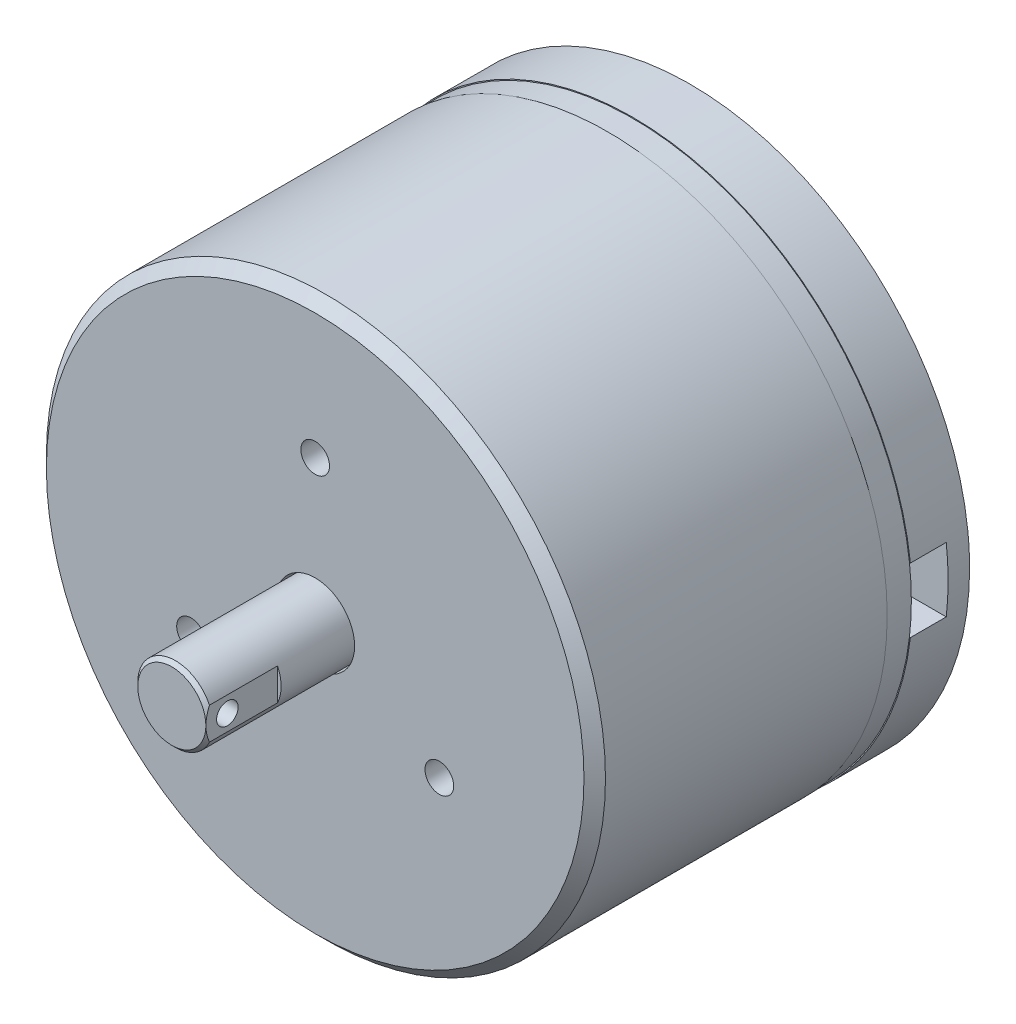
ISO-10303-21;
HEADER;
FILE_DESCRIPTION(('STEP AP214'),'2;1');
FILE_NAME('part.step','',(''),(''),'','','');
FILE_SCHEMA(('AUTOMOTIVE_DESIGN { 1 0 10303 214 1 1 1 1 }'));
ENDSEC;
DATA;
#1=APPLICATION_CONTEXT('core data for automotive mechanical design processes');
#2=APPLICATION_PROTOCOL_DEFINITION('international standard','automotive_design',2000,#1);
#3=PRODUCT_CONTEXT('',#1,'mechanical');
#4=PRODUCT('Part','Part','',(#3));
#5=PRODUCT_RELATED_PRODUCT_CATEGORY('part','',(#4));
#6=PRODUCT_DEFINITION_FORMATION('','',#4);
#7=PRODUCT_DEFINITION_CONTEXT('part definition',#1,'design');
#8=PRODUCT_DEFINITION('design','',#6,#7);
#9=PRODUCT_DEFINITION_SHAPE('','',#8);
#10=(LENGTH_UNIT() NAMED_UNIT(*) SI_UNIT(.MILLI.,.METRE.));
#11=(NAMED_UNIT(*) PLANE_ANGLE_UNIT() SI_UNIT($,.RADIAN.));
#12=(NAMED_UNIT(*) SI_UNIT($,.STERADIAN.) SOLID_ANGLE_UNIT());
#13=UNCERTAINTY_MEASURE_WITH_UNIT(LENGTH_MEASURE(1.E-05),#10,'distance_accuracy_value','');
#14=(GEOMETRIC_REPRESENTATION_CONTEXT(3) GLOBAL_UNCERTAINTY_ASSIGNED_CONTEXT((#13)) GLOBAL_UNIT_ASSIGNED_CONTEXT((#10,
#11,#12)) REPRESENTATION_CONTEXT('',''));
#15=CARTESIAN_POINT('',(0.,0.,0.));
#16=DIRECTION('',(0.,0.,1.));
#17=DIRECTION('',(1.,0.,0.));
#18=AXIS2_PLACEMENT_3D('',#15,#16,#17);
#19=CARTESIAN_POINT('',(0.,0.,53.8));
#20=DIRECTION('',(0.,0.,-1.));
#21=DIRECTION('',(-1.,0.,0.));
#22=AXIS2_PLACEMENT_3D('',#19,#20,#21);
#23=CYLINDRICAL_SURFACE('',#22,39.);
#24=CARTESIAN_POINT('',(0.,0.,52.3000000000001));
#25=DIRECTION('',(0.,0.,1.));
#26=DIRECTION('',(1.,0.,0.));
#27=AXIS2_PLACEMENT_3D('',#24,#25,#26);
#28=CIRCLE('',#27,39.);
#29=CARTESIAN_POINT('',(-39.,0.,52.3000000000001));
#30=VERTEX_POINT('',#29);
#31=EDGE_CURVE('E296',#30,#30,#28,.F.);
#32=CARTESIAN_POINT('',(0.,0.,13.));
#33=DIRECTION('',(0.,0.,-1.));
#34=DIRECTION('',(-1.,0.,0.));
#35=AXIS2_PLACEMENT_3D('',#32,#33,#34);
#36=CIRCLE('',#35,39.);
#37=CARTESIAN_POINT('',(-39.,0.,13.));
#38=VERTEX_POINT('',#37);
#39=EDGE_CURVE('E318',#38,#38,#36,.T.);
#40=CARTESIAN_POINT('',(-39.,0.,52.3000000000001));
#41=CARTESIAN_POINT('',(-39.,0.,51.8906250000001));
#42=CARTESIAN_POINT('',(-39.,0.,51.4812500000001));
#43=CARTESIAN_POINT('',(-39.,0.,50.6625000000001));
#44=CARTESIAN_POINT('',(-39.,0.,50.2531250000001));
#45=CARTESIAN_POINT('',(-39.,0.,49.4343750000001));
#46=CARTESIAN_POINT('',(-39.,0.,49.0250000000001));
#47=CARTESIAN_POINT('',(-39.,0.,48.2062500000001));
#48=CARTESIAN_POINT('',(-39.,0.,47.7968750000001));
#49=CARTESIAN_POINT('',(-39.,0.,46.9781250000001));
#50=CARTESIAN_POINT('',(-39.,0.,46.5687500000001));
#51=CARTESIAN_POINT('',(-39.,0.,45.7500000000001));
#52=CARTESIAN_POINT('',(-39.,0.,45.3406250000001));
#53=CARTESIAN_POINT('',(-39.,0.,44.5218750000001));
#54=CARTESIAN_POINT('',(-39.,0.,44.1125000000001));
#55=CARTESIAN_POINT('',(-39.,0.,43.2937500000001));
#56=CARTESIAN_POINT('',(-39.,0.,42.884375));
#57=CARTESIAN_POINT('',(-39.,0.,42.0656250000001));
#58=CARTESIAN_POINT('',(-39.,0.,41.6562500000001));
#59=CARTESIAN_POINT('',(-39.,0.,40.8375));
#60=CARTESIAN_POINT('',(-39.,0.,40.4281250000001));
#61=CARTESIAN_POINT('',(-39.,0.,39.609375));
#62=CARTESIAN_POINT('',(-39.,0.,39.2));
#63=CARTESIAN_POINT('',(-39.,0.,38.3812500000001));
#64=CARTESIAN_POINT('',(-39.,0.,37.9718750000001));
#65=CARTESIAN_POINT('',(-39.,0.,37.1531250000001));
#66=CARTESIAN_POINT('',(-39.,0.,36.7437500000001));
#67=CARTESIAN_POINT('',(-39.,0.,35.925));
#68=CARTESIAN_POINT('',(-39.,0.,35.515625));
#69=CARTESIAN_POINT('',(-39.,0.,34.696875));
#70=CARTESIAN_POINT('',(-39.,0.,34.2875));
#71=CARTESIAN_POINT('',(-39.,0.,33.46875));
#72=CARTESIAN_POINT('',(-39.,0.,33.0593750000001));
#73=CARTESIAN_POINT('',(-39.,0.,32.240625));
#74=CARTESIAN_POINT('',(-39.,0.,31.83125));
#75=CARTESIAN_POINT('',(-39.,0.,31.0125));
#76=CARTESIAN_POINT('',(-39.,0.,30.603125));
#77=CARTESIAN_POINT('',(-39.,0.,29.784375));
#78=CARTESIAN_POINT('',(-39.,0.,29.375));
#79=CARTESIAN_POINT('',(-39.,0.,28.55625));
#80=CARTESIAN_POINT('',(-39.,0.,28.146875));
#81=CARTESIAN_POINT('',(-39.,0.,27.328125));
#82=CARTESIAN_POINT('',(-39.,0.,26.91875));
#83=CARTESIAN_POINT('',(-39.,0.,26.1));
#84=CARTESIAN_POINT('',(-39.,0.,25.690625));
#85=CARTESIAN_POINT('',(-39.,0.,24.871875));
#86=CARTESIAN_POINT('',(-39.,0.,24.4625));
#87=CARTESIAN_POINT('',(-39.,0.,23.64375));
#88=CARTESIAN_POINT('',(-39.,0.,23.234375));
#89=CARTESIAN_POINT('',(-39.,0.,22.415625));
#90=CARTESIAN_POINT('',(-39.,0.,22.00625));
#91=CARTESIAN_POINT('',(-39.,0.,21.1875));
#92=CARTESIAN_POINT('',(-39.,0.,20.778125));
#93=CARTESIAN_POINT('',(-39.,0.,19.959375));
#94=CARTESIAN_POINT('',(-39.,0.,19.55));
#95=CARTESIAN_POINT('',(-39.,0.,18.73125));
#96=CARTESIAN_POINT('',(-39.,0.,18.321875));
#97=CARTESIAN_POINT('',(-39.,0.,17.503125));
#98=CARTESIAN_POINT('',(-39.,0.,17.09375));
#99=CARTESIAN_POINT('',(-39.,0.,16.275));
#100=CARTESIAN_POINT('',(-39.,0.,15.865625));
#101=CARTESIAN_POINT('',(-39.,0.,15.046875));
#102=CARTESIAN_POINT('',(-39.,0.,14.6375));
#103=CARTESIAN_POINT('',(-39.,0.,13.81875));
#104=CARTESIAN_POINT('',(-39.,0.,13.409375));
#105=CARTESIAN_POINT('',(-39.,0.,13.));
#106=B_SPLINE_CURVE_WITH_KNOTS('',3,(#40,#41,#42,#43,#44,#45,#46,#47,#48,#49,#50,#51,#52,#53,
#54,#55,#56,#57,#58,#59,#60,#61,#62,#63,#64,#65,#66,#67,#68,#69,#70,#71,#72,#73,#74,#75,#76,#77,
#78,#79,#80,#81,#82,#83,#84,#85,#86,#87,#88,#89,#90,#91,#92,#93,#94,#95,#96,#97,#98,#99,#100,
#101,#102,#103,#104,#105),.UNSPECIFIED.,.F.,.F.,(4,2,2,2,2,2,2,2,2,2,2,2,2,2,2,2,2,2,2,2,2,2,2,
2,2,2,2,2,2,2,2,2,4),(0.,1.228125,2.45625000000001,3.684375,4.91250000000001,6.140625,
7.36875000000001,8.59687500000001,9.82500000000001,11.053125,12.28125,13.509375,14.7375,
15.965625,17.19375,18.421875,19.65,20.878125,22.10625,23.334375,24.5625,25.790625,27.01875,
28.246875,29.475,30.703125,31.93125,33.159375,34.3875,35.615625,36.84375,38.071875,39.3),.UNSPECIFIED.);
#107=EDGE_CURVE('BSEAM36',#30,#38,#106,.T.);
#108=ORIENTED_EDGE('',*,*,#31,.T.);
#109=ORIENTED_EDGE('',*,*,#39,.F.);
#110=ORIENTED_EDGE('',*,*,#107,.T.);
#111=ORIENTED_EDGE('',*,*,#107,.F.);
#112=EDGE_LOOP('',(#108,#110,#109,#111));
#113=FACE_BOUND('',#112,.T.);
#114=ADVANCED_FACE('F36',(#113),#23,.T.);
#115=CARTESIAN_POINT('',(0.,0.,53.8));
#116=DIRECTION('',(0.,0.,1.));
#117=DIRECTION('',(1.,0.,0.));
#118=AXIS2_PLACEMENT_3D('',#115,#116,#117);
#119=PLANE('',#118);
#120=CARTESIAN_POINT('',(0.,0.,53.8));
#121=DIRECTION('',(0.,0.,1.));
#122=DIRECTION('',(1.,0.,0.));
#123=AXIS2_PLACEMENT_3D('',#120,#121,#122);
#124=CIRCLE('',#123,37.5000000000001);
#125=CARTESIAN_POINT('',(37.5000000000001,0.,53.8));
#126=VERTEX_POINT('',#125);
#127=EDGE_CURVE('E294',#126,#126,#124,.T.);
#128=ORIENTED_EDGE('',*,*,#127,.T.);
#129=EDGE_LOOP('',(#128));
#130=FACE_BOUND('',#129,.T.);
#131=CARTESIAN_POINT('',(0.,0.,53.8));
#132=DIRECTION('',(0.,0.,1.));
#133=DIRECTION('',(1.,0.,0.));
#134=AXIS2_PLACEMENT_3D('',#131,#132,#133);
#135=CIRCLE('',#134,5.5);
#136=CARTESIAN_POINT('',(5.5,0.,53.8));
#137=VERTEX_POINT('',#136);
#138=EDGE_CURVE('E147',#137,#137,#135,.T.);
#139=ORIENTED_EDGE('',*,*,#138,.F.);
#140=EDGE_LOOP('',(#139));
#141=FACE_BOUND('',#140,.T.);
#142=CARTESIAN_POINT('',(0.,20.,53.8));
#143=DIRECTION('',(0.,0.,1.));
#144=DIRECTION('',(1.,0.,0.));
#145=AXIS2_PLACEMENT_3D('',#142,#143,#144);
#146=CIRCLE('',#145,2.);
#147=CARTESIAN_POINT('',(2.,20.,53.8));
#148=VERTEX_POINT('',#147);
#149=EDGE_CURVE('E163',#148,#148,#146,.T.);
#150=ORIENTED_EDGE('',*,*,#149,.F.);
#151=EDGE_LOOP('',(#150));
#152=FACE_BOUND('',#151,.T.);
#153=CARTESIAN_POINT('',(17.3205080756901,-9.99999999999925,53.8));
#154=DIRECTION('',(0.,0.,1.));
#155=DIRECTION('',(1.,0.,0.));
#156=AXIS2_PLACEMENT_3D('',#153,#154,#155);
#157=CIRCLE('',#156,2.00000000000111);
#158=CARTESIAN_POINT('',(19.3205080756912,-9.99999999999925,53.8));
#159=VERTEX_POINT('',#158);
#160=EDGE_CURVE('E157',#159,#159,#157,.T.);
#161=ORIENTED_EDGE('',*,*,#160,.F.);
#162=EDGE_LOOP('',(#161));
#163=FACE_BOUND('',#162,.T.);
#164=CARTESIAN_POINT('',(-17.3205080756875,-10.0000000000007,53.8));
#165=DIRECTION('',(0.,0.,1.));
#166=DIRECTION('',(1.,0.,0.));
#167=AXIS2_PLACEMENT_3D('',#164,#165,#166);
#168=CIRCLE('',#167,2.00000000000161);
#169=CARTESIAN_POINT('',(-15.3205080756859,-10.0000000000007,53.8));
#170=VERTEX_POINT('',#169);
#171=EDGE_CURVE('E151',#170,#170,#168,.T.);
#172=ORIENTED_EDGE('',*,*,#171,.F.);
#173=EDGE_LOOP('',(#172));
#174=FACE_BOUND('',#173,.T.);
#175=ADVANCED_FACE('F199',(#130,#141,#152,#163,#174),#119,.T.);
#176=CARTESIAN_POINT('',(0.,20.,50.8));
#177=DIRECTION('',(0.,0.,1.));
#178=DIRECTION('',(1.,0.,0.));
#179=AXIS2_PLACEMENT_3D('',#176,#177,#178);
#180=CYLINDRICAL_SURFACE('',#179,2.);
#181=CARTESIAN_POINT('',(0.,20.,50.8));
#182=DIRECTION('',(0.,0.,1.));
#183=DIRECTION('',(1.,0.,0.));
#184=AXIS2_PLACEMENT_3D('',#181,#182,#183);
#185=CIRCLE('',#184,2.);
#186=CARTESIAN_POINT('',(2.,20.,50.8));
#187=VERTEX_POINT('',#186);
#188=EDGE_CURVE('E166',#187,#187,#185,.T.);
#189=ORIENTED_EDGE('',*,*,#188,.F.);
#190=EDGE_LOOP('',(#189));
#191=FACE_BOUND('',#190,.T.);
#192=ORIENTED_EDGE('',*,*,#149,.T.);
#193=EDGE_LOOP('',(#192));
#194=FACE_BOUND('',#193,.T.);
#195=ADVANCED_FACE('F209',(#191,#194),#180,.F.);
#196=CARTESIAN_POINT('',(0.,20.,50.8));
#197=DIRECTION('',(0.,0.,1.));
#198=DIRECTION('',(1.,0.,0.));
#199=AXIS2_PLACEMENT_3D('',#196,#197,#198);
#200=PLANE('',#199);
#201=ORIENTED_EDGE('',*,*,#188,.T.);
#202=EDGE_LOOP('',(#201));
#203=FACE_BOUND('',#202,.T.);
#204=ADVANCED_FACE('F213',(#203),#200,.T.);
#205=CARTESIAN_POINT('',(17.3205080756901,-9.99999999999925,50.8));
#206=DIRECTION('',(0.,0.,1.));
#207=DIRECTION('',(1.,0.,0.));
#208=AXIS2_PLACEMENT_3D('',#205,#206,#207);
#209=CYLINDRICAL_SURFACE('',#208,2.00000000000111);
#210=CARTESIAN_POINT('',(17.3205080756901,-9.99999999999925,50.8));
#211=DIRECTION('',(0.,0.,1.));
#212=DIRECTION('',(1.,0.,0.));
#213=AXIS2_PLACEMENT_3D('',#210,#211,#212);
#214=CIRCLE('',#213,2.00000000000111);
#215=CARTESIAN_POINT('',(19.3205080756912,-9.99999999999925,50.8));
#216=VERTEX_POINT('',#215);
#217=EDGE_CURVE('E160',#216,#216,#214,.T.);
#218=ORIENTED_EDGE('',*,*,#217,.F.);
#219=EDGE_LOOP('',(#218));
#220=FACE_BOUND('',#219,.T.);
#221=ORIENTED_EDGE('',*,*,#160,.T.);
#222=EDGE_LOOP('',(#221));
#223=FACE_BOUND('',#222,.T.);
#224=ADVANCED_FACE('F217',(#220,#223),#209,.F.);
#225=CARTESIAN_POINT('',(17.3205080756901,-9.99999999999925,50.8));
#226=DIRECTION('',(0.,0.,1.));
#227=DIRECTION('',(1.,0.,0.));
#228=AXIS2_PLACEMENT_3D('',#225,#226,#227);
#229=PLANE('',#228);
#230=ORIENTED_EDGE('',*,*,#217,.T.);
#231=EDGE_LOOP('',(#230));
#232=FACE_BOUND('',#231,.T.);
#233=ADVANCED_FACE('F221',(#232),#229,.T.);
#234=CARTESIAN_POINT('',(-17.3205080756875,-10.0000000000007,50.8));
#235=DIRECTION('',(0.,0.,1.));
#236=DIRECTION('',(1.,0.,0.));
#237=AXIS2_PLACEMENT_3D('',#234,#235,#236);
#238=CYLINDRICAL_SURFACE('',#237,2.00000000000161);
#239=CARTESIAN_POINT('',(-17.3205080756875,-10.0000000000007,50.8));
#240=DIRECTION('',(0.,0.,1.));
#241=DIRECTION('',(1.,0.,0.));
#242=AXIS2_PLACEMENT_3D('',#239,#240,#241);
#243=CIRCLE('',#242,2.00000000000161);
#244=CARTESIAN_POINT('',(-15.3205080756859,-10.0000000000007,50.8));
#245=VERTEX_POINT('',#244);
#246=EDGE_CURVE('E154',#245,#245,#243,.T.);
#247=ORIENTED_EDGE('',*,*,#246,.F.);
#248=EDGE_LOOP('',(#247));
#249=FACE_BOUND('',#248,.T.);
#250=ORIENTED_EDGE('',*,*,#171,.T.);
#251=EDGE_LOOP('',(#250));
#252=FACE_BOUND('',#251,.T.);
#253=ADVANCED_FACE('F225',(#249,#252),#238,.F.);
#254=CARTESIAN_POINT('',(-17.3205080756875,-10.0000000000007,50.8));
#255=DIRECTION('',(0.,0.,1.));
#256=DIRECTION('',(1.,0.,0.));
#257=AXIS2_PLACEMENT_3D('',#254,#255,#256);
#258=PLANE('',#257);
#259=ORIENTED_EDGE('',*,*,#246,.T.);
#260=EDGE_LOOP('',(#259));
#261=FACE_BOUND('',#260,.T.);
#262=ADVANCED_FACE('F229',(#261),#258,.T.);
#263=CARTESIAN_POINT('',(0.,0.,43.8));
#264=DIRECTION('',(0.,0.,1.));
#265=DIRECTION('',(1.,0.,0.));
#266=AXIS2_PLACEMENT_3D('',#263,#264,#265);
#267=CYLINDRICAL_SURFACE('',#266,5.5);
#268=CARTESIAN_POINT('',(0.,0.,43.8));
#269=DIRECTION('',(0.,0.,1.));
#270=DIRECTION('',(1.,0.,0.));
#271=AXIS2_PLACEMENT_3D('',#268,#269,#270);
#272=CIRCLE('',#271,5.5);
#273=CARTESIAN_POINT('',(5.5,0.,43.8));
#274=VERTEX_POINT('',#273);
#275=EDGE_CURVE('E148',#274,#274,#272,.T.);
#276=ORIENTED_EDGE('',*,*,#275,.F.);
#277=EDGE_LOOP('',(#276));
#278=FACE_BOUND('',#277,.T.);
#279=ORIENTED_EDGE('',*,*,#138,.T.);
#280=EDGE_LOOP('',(#279));
#281=FACE_BOUND('',#280,.T.);
#282=ADVANCED_FACE('F233',(#278,#281),#267,.F.);
#283=CARTESIAN_POINT('',(0.,0.,43.8));
#284=DIRECTION('',(0.,0.,1.));
#285=DIRECTION('',(1.,0.,0.));
#286=AXIS2_PLACEMENT_3D('',#283,#284,#285);
#287=PLANE('',#286);
#288=CARTESIAN_POINT('',(0.,0.,43.8));
#289=DIRECTION('',(0.,0.,1.));
#290=DIRECTION('',(1.,0.,0.));
#291=AXIS2_PLACEMENT_3D('',#288,#289,#290);
#292=CIRCLE('',#291,5.25);
#293=CARTESIAN_POINT('',(5.25,0.,43.8));
#294=VERTEX_POINT('',#293);
#295=EDGE_CURVE('E144',#294,#294,#292,.T.);
#296=ORIENTED_EDGE('',*,*,#295,.F.);
#297=EDGE_LOOP('',(#296));
#298=FACE_BOUND('',#297,.T.);
#299=ORIENTED_EDGE('',*,*,#275,.T.);
#300=EDGE_LOOP('',(#299));
#301=FACE_BOUND('',#300,.T.);
#302=ADVANCED_FACE('F474',(#298,#301),#287,.T.);
#303=CARTESIAN_POINT('',(0.,0.,73.8));
#304=DIRECTION('',(0.,0.,1.));
#305=DIRECTION('',(1.,0.,0.));
#306=AXIS2_PLACEMENT_3D('',#303,#304,#305);
#307=PLANE('',#306);
#308=CARTESIAN_POINT('',(0.,0.,73.8));
#309=DIRECTION('',(0.,0.,1.));
#310=DIRECTION('',(1.,0.,0.));
#311=AXIS2_PLACEMENT_3D('',#308,#309,#310);
#312=CIRCLE('',#311,4.75);
#313=CARTESIAN_POINT('',(4.75,0.,73.8));
#314=VERTEX_POINT('',#313);
#315=EDGE_CURVE('E169',#314,#314,#312,.T.);
#316=ORIENTED_EDGE('',*,*,#315,.T.);
#317=EDGE_LOOP('',(#316));
#318=FACE_BOUND('',#317,.T.);
#319=ADVANCED_FACE('F238',(#318),#307,.T.);
#320=CARTESIAN_POINT('',(0.,0.,73.8));
#321=DIRECTION('',(0.,0.,-1.));
#322=DIRECTION('',(-1.,0.,0.));
#323=AXIS2_PLACEMENT_3D('',#320,#321,#322);
#324=CYLINDRICAL_SURFACE('',#323,5.25);
#325=CARTESIAN_POINT('',(-5.25,0.,69.3));
#326=CARTESIAN_POINT('',(-5.24999901970756,0.0824661767829383,69.3000014546715));
#327=CARTESIAN_POINT('',(-5.24803813051532,0.164947310904436,69.3068233417321));
#328=CARTESIAN_POINT('',(-5.24040679458827,0.327518993397742,69.3338732025767));
#329=CARTESIAN_POINT('',(-5.23473494407563,0.407608625122212,69.3541062495556));
#330=CARTESIAN_POINT('',(-5.22030518511805,0.563028225553406,69.4072560288124));
#331=CARTESIAN_POINT('',(-5.21155158079756,0.638364660636173,69.440155077114));
#332=CARTESIAN_POINT('',(-5.19187483737408,0.782451570846958,69.5176334936088));
#333=CARTESIAN_POINT('',(-5.18095147131017,0.851201355883627,69.5622140838678));
#334=CARTESIAN_POINT('',(-5.15778550969185,0.981970835144209,69.6630262580047));
#335=CARTESIAN_POINT('',(-5.14551781458893,1.0437927917857,69.7195085653915));
#336=CARTESIAN_POINT('',(-5.12120051186731,1.15722851844326,69.8419858073533));
#337=CARTESIAN_POINT('',(-5.10915093719508,1.20884075780837,69.9079821657242));
#338=CARTESIAN_POINT('',(-5.08637261156541,1.30139842504823,70.0492451870932));
#339=CARTESIAN_POINT('',(-5.07567526879513,1.34210865827511,70.1246714887987));
#340=CARTESIAN_POINT('',(-5.057185078805,1.41018877915485,70.2816540088131));
#341=CARTESIAN_POINT('',(-5.04939160683654,1.43756153666789,70.3632089040532));
#342=CARTESIAN_POINT('',(-5.03785206147012,1.47748824760406,70.5279260723742));
#343=CARTESIAN_POINT('',(-5.03400733927509,1.49040414902137,70.6109935220759));
#344=CARTESIAN_POINT('',(-5.03050656151496,1.50218000841888,70.7781983613346));
#345=CARTESIAN_POINT('',(-5.03084959580709,1.50104302057215,70.8623355144377));
#346=CARTESIAN_POINT('',(-5.03559775807451,1.48503101072177,71.0264014585921));
#347=CARTESIAN_POINT('',(-5.03987087023452,1.47060244296293,71.1063782633856));
#348=CARTESIAN_POINT('',(-5.05178511287108,1.42913539564342,71.2627254147207));
#349=CARTESIAN_POINT('',(-5.05942654782303,1.40209577610937,71.3390954345404));
#350=CARTESIAN_POINT('',(-5.0773264763706,1.33583010853359,71.4871846833238));
#351=CARTESIAN_POINT('',(-5.08761687304236,1.29645413379661,71.5588328043012));
#352=CARTESIAN_POINT('',(-5.10963912661544,1.20673784375914,71.69465742091));
#353=CARTESIAN_POINT('',(-5.12137130416434,1.15639508755008,71.7588322483012));
#354=CARTESIAN_POINT('',(-5.14549687992267,1.04392799754765,71.8804292817048));
#355=CARTESIAN_POINT('',(-5.15789853429274,0.981431156133995,71.9375058569754));
#356=CARTESIAN_POINT('',(-5.18157185413758,0.847599211789668,72.0404445027302));
#357=CARTESIAN_POINT('',(-5.19284346103369,0.776263651111415,72.0863059920313));
#358=CARTESIAN_POINT('',(-5.21307396049126,0.62619230481858,72.1656965510805));
#359=CARTESIAN_POINT('',(-5.22201956622922,0.547417363357502,72.1991552151031));
#360=CARTESIAN_POINT('',(-5.23649438615689,0.385044922475602,72.2522504185626));
#361=CARTESIAN_POINT('',(-5.24202446142191,0.301448644357611,72.2718904419339));
#362=CARTESIAN_POINT('',(-5.24891155886005,0.134749791483263,72.2962299642821));
#363=CARTESIAN_POINT('',(-5.25039954637952,0.0517210101453808,72.3013985215298));
#364=CARTESIAN_POINT('',(-5.24941563530316,-0.114019895104187,72.2979545502742));
#365=CARTESIAN_POINT('',(-5.24694421185463,-0.19673205581783,72.2893436753656));
#366=CARTESIAN_POINT('',(-5.23840445013913,-0.357763975072741,72.2589671667628));
#367=CARTESIAN_POINT('',(-5.23240959763292,-0.436138658801144,72.2374701140074));
#368=CARTESIAN_POINT('',(-5.21750999056379,-0.588156514654224,72.1822496235115));
#369=CARTESIAN_POINT('',(-5.20860489949282,-0.661799138436506,72.1485247718331));
#370=CARTESIAN_POINT('',(-5.18857470876985,-0.804031263840056,72.0689824975161));
#371=CARTESIAN_POINT('',(-5.17740572384231,-0.872476864905192,72.0229191008807));
#372=CARTESIAN_POINT('',(-5.15413460323354,-1.00082889604448,71.920310620537));
#373=CARTESIAN_POINT('',(-5.14203225564551,-1.06073337813182,71.8637631524528));
#374=CARTESIAN_POINT('',(-5.11776464723921,-1.17232982125553,71.7395929934616));
#375=CARTESIAN_POINT('',(-5.10561027650692,-1.22368907055716,71.6716685433257));
#376=CARTESIAN_POINT('',(-5.08304171044126,-1.31429648704887,71.5279030585365));
#377=CARTESIAN_POINT('',(-5.0726274545694,-1.35354507560828,71.4520622994402));
#378=CARTESIAN_POINT('',(-5.05483988458072,-1.41853090589125,71.2949315917562));
#379=CARTESIAN_POINT('',(-5.04745050118528,-1.44433974931832,71.2136731773205));
#380=CARTESIAN_POINT('',(-5.03656842598252,-1.48184587553055,71.0477175482592));
#381=CARTESIAN_POINT('',(-5.0330745534607,-1.49354743426741,70.9630213836735));
#382=CARTESIAN_POINT('',(-5.03048777321363,-1.50223518184644,70.7960279753088));
#383=CARTESIAN_POINT('',(-5.03123370599554,-1.49976020733171,70.7137608715856));
#384=CARTESIAN_POINT('',(-5.03665947911099,-1.48143533218232,70.5508689520007));
#385=CARTESIAN_POINT('',(-5.04133918817575,-1.4655858778494,70.4702440814302));
#386=CARTESIAN_POINT('',(-5.05400232868674,-1.42129476612471,70.3137162216243));
#387=CARTESIAN_POINT('',(-5.06195157786269,-1.39298318839764,70.2377734597418));
#388=CARTESIAN_POINT('',(-5.08025477132046,-1.32467211976195,70.0916559491306));
#389=CARTESIAN_POINT('',(-5.0906091411192,-1.28467056032366,70.021482224045));
#390=CARTESIAN_POINT('',(-5.11298751712321,-1.19254909901118,69.8863623586461));
#391=CARTESIAN_POINT('',(-5.12505572384263,-1.14006920792048,69.8216689564935));
#392=CARTESIAN_POINT('',(-5.14927383819209,-1.02514488028451,69.7018320781426));
#393=CARTESIAN_POINT('',(-5.16142376562885,-0.962697938046412,69.6466910106669));
#394=CARTESIAN_POINT('',(-5.18480969679264,-0.827680740649032,69.546122111755));
#395=CARTESIAN_POINT('',(-5.19601425778057,-0.754891876769824,69.5009797595478));
#396=CARTESIAN_POINT('',(-5.21588546833481,-0.602437897234987,69.4236406612335));
#397=CARTESIAN_POINT('',(-5.22455350402716,-0.522776568086048,69.3914368410502));
#398=CARTESIAN_POINT('',(-5.2374550854398,-0.369687236501272,69.3443643364534));
#399=CARTESIAN_POINT('',(-5.24212263271557,-0.296822255718289,69.3277698474866));
#400=CARTESIAN_POINT('',(-5.24839532889111,-0.149308776589773,69.3055877570684));
#401=CARTESIAN_POINT('',(-5.25000088750497,-0.0746605182120678,69.2999986830173));
#402=CARTESIAN_POINT('',(-5.25,0.,69.3));
#403=B_SPLINE_CURVE_WITH_KNOTS('',3,(#325,#326,#327,#328,#329,#330,#331,#332,#333,#334,#335,
#336,#337,#338,#339,#340,#341,#342,#343,#344,#345,#346,#347,#348,#349,#350,#351,#352,#353,#354,
#355,#356,#357,#358,#359,#360,#361,#362,#363,#364,#365,#366,#367,#368,#369,#370,#371,#372,#373,
#374,#375,#376,#377,#378,#379,#380,#381,#382,#383,#384,#385,#386,#387,#388,#389,#390,#391,#392,
#393,#394,#395,#396,#397,#398,#399,#400,#401,#402),.UNSPECIFIED.,.T.,.F.,(4,2,2,2,2,2,2,2,2,2,2,
2,2,2,2,2,2,2,2,2,2,2,2,2,2,2,2,2,2,2,2,2,2,2,2,2,2,2,4),(0.,0.247124484406758,
0.494342504846386,0.741216609671518,0.988116551576375,1.24085858648086,1.49363848405285,
1.75149806475043,2.00930213658606,2.26049632397061,2.51163591923425,2.75463589371999,
2.99765783839593,3.24375602468407,3.48990904183007,3.74533875451876,4.00078170116586,
4.25765325828336,4.51446003010958,4.7628409327365,5.01119203075986,5.25453855359639,
5.49791322431646,5.74655644008338,5.9952562739084,6.25209078663251,6.50891636223974,
6.76435930022605,7.01972479336602,7.26545011208156,7.51116723135288,7.75437822214251,
7.99763227493984,8.24900742663575,8.50044587327156,8.75833484223425,9.01608261921368,
9.23984601024261,9.4635794581659),.UNSPECIFIED.);
#404=CARTESIAN_POINT('',(-5.25,0.,69.3));
#405=VERTEX_POINT('',#404);
#406=EDGE_CURVE('E242',#405,#405,#403,.T.);
#407=ORIENTED_EDGE('',*,*,#406,.T.);
#408=EDGE_LOOP('',(#407));
#409=FACE_BOUND('',#408,.T.);
#410=CARTESIAN_POINT('',(0.,0.,73.3));
#411=DIRECTION('',(0.,0.,1.));
#412=DIRECTION('',(1.,0.,0.));
#413=AXIS2_PLACEMENT_3D('',#410,#411,#412);
#414=CIRCLE('',#413,5.25);
#415=CARTESIAN_POINT('',(4.75,-2.23606797749979,73.3));
#416=VERTEX_POINT('',#415);
#417=CARTESIAN_POINT('',(4.75,2.23606797749979,73.3));
#418=VERTEX_POINT('',#417);
#419=EDGE_CURVE('E174',#416,#418,#414,.F.);
#420=ORIENTED_EDGE('',*,*,#419,.T.);
#421=DIRECTION('',(0.,0.,-1.));
#422=VECTOR('',#421,1.);
#423=CARTESIAN_POINT('',(4.75,2.23606797749979,73.8));
#424=LINE('',#423,#422);
#425=CARTESIAN_POINT('',(4.75,2.23606797749979,63.8));
#426=VERTEX_POINT('',#425);
#427=EDGE_CURVE('E141',#418,#426,#424,.T.);
#428=ORIENTED_EDGE('',*,*,#427,.T.);
#429=CARTESIAN_POINT('',(0.,0.,63.8));
#430=DIRECTION('',(0.,0.,-1.));
#431=DIRECTION('',(-1.,0.,0.));
#432=AXIS2_PLACEMENT_3D('',#429,#430,#431);
#433=CIRCLE('',#432,5.25);
#434=CARTESIAN_POINT('',(4.75,-2.23606797749979,63.8));
#435=VERTEX_POINT('',#434);
#436=EDGE_CURVE('E184',#426,#435,#433,.T.);
#437=ORIENTED_EDGE('',*,*,#436,.T.);
#438=DIRECTION('',(0.,0.,-1.));
#439=VECTOR('',#438,1.);
#440=CARTESIAN_POINT('',(4.75,-2.23606797749979,73.8));
#441=LINE('',#440,#439);
#442=EDGE_CURVE('E138',#435,#416,#441,.F.);
#443=ORIENTED_EDGE('',*,*,#442,.T.);
#444=EDGE_LOOP('',(#420,#428,#437,#443));
#445=FACE_BOUND('',#444,.T.);
#446=ORIENTED_EDGE('',*,*,#295,.T.);
#447=EDGE_LOOP('',(#446));
#448=FACE_BOUND('',#447,.T.);
#449=ADVANCED_FACE('F195',(#409,#445,#448),#324,.T.);
#450=CARTESIAN_POINT('',(0.,0.,73.8));
#451=DIRECTION('',(0.,0.,-1.));
#452=DIRECTION('',(-1.,0.,0.));
#453=AXIS2_PLACEMENT_3D('',#450,#451,#452);
#454=CONICAL_SURFACE('',#453,4.75,0.785398163397458);
#455=CARTESIAN_POINT('',(4.75,-3.62033956868144,72.577617008885));
#456=CARTESIAN_POINT('',(4.75,-3.53156483008853,72.631424538858));
#457=CARTESIAN_POINT('',(4.75,-3.4422413972833,72.6843251798539));
#458=CARTESIAN_POINT('',(4.75,-3.26236616348565,72.7880455460679));
#459=CARTESIAN_POINT('',(4.75,-3.17181406261238,72.8388647506495));
#460=CARTESIAN_POINT('',(4.75,-2.89744370090463,72.9881629952957));
#461=CARTESIAN_POINT('',(4.75,-2.71163105311216,73.0830407292377));
#462=CARTESIAN_POINT('',(4.75,-2.33035223413251,73.2618867564705));
#463=CARTESIAN_POINT('',(4.75,-2.13476869528085,73.3456075684328));
#464=CARTESIAN_POINT('',(4.75,-1.73723696168157,73.4956192426765));
#465=CARTESIAN_POINT('',(4.75,-1.53530066311995,73.5619407373815));
#466=CARTESIAN_POINT('',(4.75,-1.21208045105927,73.6491176330868));
#467=CARTESIAN_POINT('',(4.75,-1.09277297353138,73.6773430487512));
#468=CARTESIAN_POINT('',(4.75,-0.852472540073252,73.7255450044473));
#469=CARTESIAN_POINT('',(4.75,-0.731479502447406,73.7455211432057));
#470=CARTESIAN_POINT('',(4.75,-0.489438861763362,73.7763454080755));
#471=CARTESIAN_POINT('',(4.75,-0.368401681347093,73.7872745815294));
#472=CARTESIAN_POINT('',(4.75,-0.125841390448064,73.7998774635269));
#473=CARTESIAN_POINT('',(4.75,-0.00431826872105143,73.8015509566476));
#474=CARTESIAN_POINT('',(4.75,0.258984478928396,73.7950579661207));
#475=CARTESIAN_POINT('',(4.75,0.400724445935439,73.7851846436697));
#476=CARTESIAN_POINT('',(4.75,0.682821260248871,73.7532218025352));
#477=CARTESIAN_POINT('',(4.75,0.823177818906465,73.7311297871269));
#478=CARTESIAN_POINT('',(4.75,1.1034484026415,73.6754763172258));
#479=CARTESIAN_POINT('',(4.75,1.24333349295753,73.6417709341525));
#480=CARTESIAN_POINT('',(4.75,1.52026272946044,73.5644196844972));
#481=CARTESIAN_POINT('',(4.75,1.65730738012885,73.5207755998916));
#482=CARTESIAN_POINT('',(4.75,1.95442556295494,73.4158579645319));
#483=CARTESIAN_POINT('',(4.75,2.11386780846319,73.3528084278025));
#484=CARTESIAN_POINT('',(4.75,2.42861575996373,73.2170369221938));
#485=CARTESIAN_POINT('',(4.75,2.58391941479584,73.1443102603671));
#486=CARTESIAN_POINT('',(4.75,2.89116622304857,72.9909023478449));
#487=CARTESIAN_POINT('',(4.75,3.04309639060256,72.9101952904111));
#488=CARTESIAN_POINT('',(4.75,3.34346202586049,72.7426160414054));
#489=CARTESIAN_POINT('',(4.75,3.49189806123038,72.6557448606084));
#490=CARTESIAN_POINT('',(4.75,3.77930692013112,72.4809614748375));
#491=CARTESIAN_POINT('',(4.75,3.91840947916132,72.3932614934441));
#492=CARTESIAN_POINT('',(4.75,4.19421481295091,72.2141537898861));
#493=CARTESIAN_POINT('',(4.75,4.33091739514384,72.122745772131));
#494=CARTESIAN_POINT('',(4.75,4.60111156131422,71.9376552724322));
#495=CARTESIAN_POINT('',(4.75,4.73462033669596,71.8439977960442));
#496=CARTESIAN_POINT('',(4.75,4.99980572609512,71.6541989887724));
#497=CARTESIAN_POINT('',(4.75,5.13148284587057,71.5580583653586));
#498=CARTESIAN_POINT('',(4.75,5.26239394159061,71.4609034428576));
#499=B_SPLINE_CURVE_WITH_KNOTS('',3,(#455,#456,#457,#458,#459,#460,#461,#462,#463,#464,#465,
#466,#467,#468,#469,#470,#471,#472,#473,#474,#475,#476,#477,#478,#479,#480,#481,#482,#483,#484,
#485,#486,#487,#488,#489,#490,#491,#492,#493,#494,#495,#496,#497,#498),.UNSPECIFIED.,.F.,.F.,(4,
2,2,2,2,2,2,2,2,2,2,2,2,2,2,2,2,2,2,2,2,4),(0.,0.31141462696883,0.622906679210834,
1.24842169214917,1.88607726904373,2.52260256911928,2.89015931181913,3.25773393164473,
3.62197885956876,3.98623226514105,4.41190747984588,4.83766970768172,5.26891056396025,
5.70007416097292,6.21403308229922,6.72824216398456,7.24417212739338,7.76001768474234,
8.25327102104123,8.74656375518125,9.23578424668876,9.72486685997346),.UNSPECIFIED.);
#500=EDGE_CURVE('E58',#418,#314,#499,.F.);
#501=ORIENTED_EDGE('',*,*,#500,.F.);
#502=ORIENTED_EDGE('',*,*,#419,.F.);
#503=EDGE_CURVE('E177',#314,#416,#499,.F.);
#504=ORIENTED_EDGE('',*,*,#503,.F.);
#505=ORIENTED_EDGE('',*,*,#315,.F.);
#506=EDGE_LOOP('',(#501,#502,#504,#505));
#507=FACE_BOUND('',#506,.T.);
#508=ADVANCED_FACE('F190',(#507),#454,.T.);
#509=CARTESIAN_POINT('',(0.,0.,63.8));
#510=DIRECTION('',(0.,0.,-1.));
#511=DIRECTION('',(-1.,0.,0.));
#512=AXIS2_PLACEMENT_3D('',#509,#510,#511);
#513=PLANE('',#512);
#514=DIRECTION('',(0.,-1.,0.));
#515=VECTOR('',#514,1.);
#516=CARTESIAN_POINT('',(4.75,-9.40893625435502,63.8));
#517=LINE('',#516,#515);
#518=EDGE_CURVE('E135',#426,#435,#517,.T.);
#519=ORIENTED_EDGE('',*,*,#518,.T.);
#520=ORIENTED_EDGE('',*,*,#436,.F.);
#521=EDGE_LOOP('',(#519,#520));
#522=FACE_BOUND('',#521,.T.);
#523=ADVANCED_FACE('F194',(#522),#513,.F.);
#524=CARTESIAN_POINT('',(4.75,0.,63.8));
#525=DIRECTION('',(-1.,0.,0.));
#526=DIRECTION('',(0.,0.,1.));
#527=AXIS2_PLACEMENT_3D('',#524,#525,#526);
#528=PLANE('',#527);
#529=CARTESIAN_POINT('',(4.75,0.,70.8));
#530=DIRECTION('',(1.,0.,0.));
#531=DIRECTION('',(0.,0.,-1.));
#532=AXIS2_PLACEMENT_3D('',#529,#530,#531);
#533=CIRCLE('',#532,1.5);
#534=CARTESIAN_POINT('',(4.75,0.,69.3));
#535=VERTEX_POINT('',#534);
#536=EDGE_CURVE('E250',#535,#535,#533,.T.);
#537=ORIENTED_EDGE('',*,*,#536,.F.);
#538=EDGE_LOOP('',(#537));
#539=FACE_BOUND('',#538,.T.);
#540=ORIENTED_EDGE('',*,*,#500,.T.);
#541=ORIENTED_EDGE('',*,*,#503,.T.);
#542=ORIENTED_EDGE('',*,*,#442,.F.);
#543=ORIENTED_EDGE('',*,*,#518,.F.);
#544=ORIENTED_EDGE('',*,*,#427,.F.);
#545=EDGE_LOOP('',(#540,#541,#542,#543,#544));
#546=FACE_BOUND('',#545,.T.);
#547=ADVANCED_FACE('F186',(#539,#546),#528,.F.);
#548=CARTESIAN_POINT('',(0.,0.,53.8));
#549=DIRECTION('',(0.,0.,-1.));
#550=DIRECTION('',(-1.,0.,0.));
#551=AXIS2_PLACEMENT_3D('',#548,#549,#550);
#552=CONICAL_SURFACE('',#551,37.5000000000001,0.785398163397446);
#553=ORIENTED_EDGE('',*,*,#31,.F.);
#554=EDGE_LOOP('',(#553));
#555=FACE_BOUND('',#554,.T.);
#556=ORIENTED_EDGE('',*,*,#127,.F.);
#557=EDGE_LOOP('',(#556));
#558=FACE_BOUND('',#557,.T.);
#559=ADVANCED_FACE('F38',(#555,#558),#552,.T.);
#560=CARTESIAN_POINT('',(39.,0.,9.50000000000005));
#561=DIRECTION('',(0.,0.,1.));
#562=DIRECTION('',(1.,0.,0.));
#563=AXIS2_PLACEMENT_3D('',#560,#561,#562);
#564=PLANE('',#563);
#565=DIRECTION('',(1.,0.,0.));
#566=VECTOR('',#565,1.);
#567=CARTESIAN_POINT('',(30.,4.5,9.50000000000003));
#568=LINE('',#567,#566);
#569=CARTESIAN_POINT('',(38.6083933472176,4.5,9.50000000000004));
#570=VERTEX_POINT('',#569);
#571=CARTESIAN_POINT('',(38.7395147104349,4.5,9.50000000000006));
#572=VERTEX_POINT('',#571);
#573=EDGE_CURVE('E98',#570,#572,#568,.T.);
#574=ORIENTED_EDGE('',*,*,#573,.T.);
#575=CARTESIAN_POINT('',(0.,0.,9.50000000000006));
#576=DIRECTION('',(0.,0.,-1.));
#577=DIRECTION('',(-1.,0.,0.));
#578=AXIS2_PLACEMENT_3D('',#575,#576,#577);
#579=CIRCLE('',#578,39.);
#580=CARTESIAN_POINT('',(38.7395147104349,-4.5,9.50000000000006));
#581=VERTEX_POINT('',#580);
#582=EDGE_CURVE('E110',#581,#572,#579,.T.);
#583=ORIENTED_EDGE('',*,*,#582,.F.);
#584=DIRECTION('',(1.,0.,0.));
#585=VECTOR('',#584,1.);
#586=CARTESIAN_POINT('',(30.,-4.5,9.50000000000003));
#587=LINE('',#586,#585);
#588=CARTESIAN_POINT('',(38.6083933472176,-4.5,9.50000000000003));
#589=VERTEX_POINT('',#588);
#590=EDGE_CURVE('E101',#589,#581,#587,.T.);
#591=ORIENTED_EDGE('',*,*,#590,.F.);
#592=CARTESIAN_POINT('',(0.,0.,9.50000000000004));
#593=DIRECTION('',(0.,0.,-1.));
#594=DIRECTION('',(-1.,0.,0.));
#595=AXIS2_PLACEMENT_3D('',#592,#593,#594);
#596=CIRCLE('',#595,38.8697573552174);
#597=EDGE_CURVE('E50',#589,#570,#596,.T.);
#598=ORIENTED_EDGE('',*,*,#597,.T.);
#599=EDGE_LOOP('',(#574,#583,#591,#598));
#600=FACE_BOUND('',#599,.T.);
#601=ADVANCED_FACE('F96',(#600),#564,.T.);
#602=CARTESIAN_POINT('',(38.8697573552174,0.,13.));
#603=DIRECTION('',(0.,0.,-1.));
#604=DIRECTION('',(-1.,0.,0.));
#605=AXIS2_PLACEMENT_3D('',#602,#603,#604);
#606=PLANE('',#605);
#607=ORIENTED_EDGE('',*,*,#39,.T.);
#608=EDGE_LOOP('',(#607));
#609=FACE_BOUND('',#608,.T.);
#610=CARTESIAN_POINT('',(0.,0.,13.));
#611=DIRECTION('',(0.,0.,-1.));
#612=DIRECTION('',(-1.,0.,0.));
#613=AXIS2_PLACEMENT_3D('',#610,#611,#612);
#614=CIRCLE('',#613,38.8697573552174);
#615=CARTESIAN_POINT('',(-38.8697573552174,0.,13.));
#616=VERTEX_POINT('',#615);
#617=EDGE_CURVE('E104',#616,#616,#614,.T.);
#618=ORIENTED_EDGE('',*,*,#617,.F.);
#619=EDGE_LOOP('',(#618));
#620=FACE_BOUND('',#619,.T.);
#621=ADVANCED_FACE('F258',(#609,#620),#606,.T.);
#622=CARTESIAN_POINT('',(0.,0.,0.));
#623=DIRECTION('',(0.,0.,-1.));
#624=DIRECTION('',(-1.,0.,0.));
#625=AXIS2_PLACEMENT_3D('',#622,#623,#624);
#626=CYLINDRICAL_SURFACE('',#625,38.8697573552174);
#627=ORIENTED_EDGE('',*,*,#617,.T.);
#628=EDGE_LOOP('',(#627));
#629=FACE_BOUND('',#628,.T.);
#630=EDGE_CURVE('E103',#570,#589,#596,.T.);
#631=ORIENTED_EDGE('',*,*,#630,.F.);
#632=ORIENTED_EDGE('',*,*,#597,.F.);
#633=EDGE_LOOP('',(#631,#632));
#634=FACE_BOUND('',#633,.T.);
#635=ADVANCED_FACE('F106',(#629,#634),#626,.T.);
#636=CARTESIAN_POINT('',(0.,0.,0.));
#637=DIRECTION('',(0.,0.,1.));
#638=DIRECTION('',(1.,0.,0.));
#639=AXIS2_PLACEMENT_3D('',#636,#637,#638);
#640=PLANE('',#639);
#641=CARTESIAN_POINT('',(0.,0.,0.));
#642=DIRECTION('',(0.,0.,1.));
#643=DIRECTION('',(1.,0.,0.));
#644=AXIS2_PLACEMENT_3D('',#641,#642,#643);
#645=CIRCLE('',#644,33.5086851120546);
#646=CARTESIAN_POINT('',(33.5086851120546,0.,0.));
#647=VERTEX_POINT('',#646);
#648=EDGE_CURVE('E128',#647,#647,#645,.T.);
#649=ORIENTED_EDGE('',*,*,#648,.F.);
#650=EDGE_LOOP('',(#649));
#651=FACE_BOUND('',#650,.T.);
#652=ADVANCED_FACE('F202',(#651),#640,.F.);
#653=CARTESIAN_POINT('',(0.,0.,1.50000000000003));
#654=DIRECTION('',(0.,0.,1.));
#655=DIRECTION('',(1.,0.,0.));
#656=AXIS2_PLACEMENT_3D('',#653,#654,#655);
#657=CONICAL_SURFACE('',#656,39.,1.30414283630616);
#658=ORIENTED_EDGE('',*,*,#648,.T.);
#659=EDGE_LOOP('',(#658));
#660=FACE_BOUND('',#659,.T.);
#661=CARTESIAN_POINT('',(0.,0.,1.50000000000003));
#662=DIRECTION('',(0.,0.,1.));
#663=DIRECTION('',(1.,0.,0.));
#664=AXIS2_PLACEMENT_3D('',#661,#662,#663);
#665=CIRCLE('',#664,39.);
#666=CARTESIAN_POINT('',(39.,0.,1.50000000000003));
#667=VERTEX_POINT('',#666);
#668=EDGE_CURVE('E131',#667,#667,#665,.T.);
#669=ORIENTED_EDGE('',*,*,#668,.F.);
#670=EDGE_LOOP('',(#669));
#671=FACE_BOUND('',#670,.T.);
#672=ADVANCED_FACE('F205',(#660,#671),#657,.T.);
#673=CARTESIAN_POINT('',(30.,4.5,4.50000000000003));
#674=DIRECTION('',(0.,0.,-1.));
#675=DIRECTION('',(0.,1.,0.));
#676=AXIS2_PLACEMENT_3D('',#673,#674,#675);
#677=PLANE('',#676);
#678=DIRECTION('',(1.,0.,0.));
#679=VECTOR('',#678,1.);
#680=CARTESIAN_POINT('',(30.,4.5,4.50000000000003));
#681=LINE('',#680,#679);
#682=CARTESIAN_POINT('',(30.,4.5,4.50000000000003));
#683=VERTEX_POINT('',#682);
#684=CARTESIAN_POINT('',(38.7395147104349,4.5,4.50000000000003));
#685=VERTEX_POINT('',#684);
#686=EDGE_CURVE('E132',#683,#685,#681,.T.);
#687=ORIENTED_EDGE('',*,*,#686,.F.);
#688=DIRECTION('',(0.,1.,0.));
#689=VECTOR('',#688,1.);
#690=CARTESIAN_POINT('',(30.,4.5,4.50000000000003));
#691=LINE('',#690,#689);
#692=CARTESIAN_POINT('',(30.,-4.5,4.50000000000003));
#693=VERTEX_POINT('',#692);
#694=EDGE_CURVE('E118',#693,#683,#691,.T.);
#695=ORIENTED_EDGE('',*,*,#694,.F.);
#696=DIRECTION('',(1.,0.,0.));
#697=VECTOR('',#696,1.);
#698=CARTESIAN_POINT('',(30.,-4.5,4.50000000000003));
#699=LINE('',#698,#697);
#700=CARTESIAN_POINT('',(38.7395147104349,-4.5,4.50000000000003));
#701=VERTEX_POINT('',#700);
#702=EDGE_CURVE('E307',#693,#701,#699,.T.);
#703=ORIENTED_EDGE('',*,*,#702,.T.);
#704=CARTESIAN_POINT('',(0.,0.,4.50000000000003));
#705=DIRECTION('',(0.,0.,-1.));
#706=DIRECTION('',(0.,1.,0.));
#707=AXIS2_PLACEMENT_3D('',#704,#705,#706);
#708=CIRCLE('',#707,39.);
#709=EDGE_CURVE('E44',#685,#701,#708,.T.);
#710=ORIENTED_EDGE('',*,*,#709,.F.);
#711=EDGE_LOOP('',(#687,#695,#703,#710));
#712=FACE_BOUND('',#711,.T.);
#713=ADVANCED_FACE('F268',(#712),#677,.F.);
#714=CARTESIAN_POINT('',(30.,0.,0.));
#715=DIRECTION('',(-1.,0.,0.));
#716=DIRECTION('',(0.,0.,1.));
#717=AXIS2_PLACEMENT_3D('',#714,#715,#716);
#718=PLANE('',#717);
#719=DIRECTION('',(0.,0.,1.));
#720=VECTOR('',#719,1.);
#721=CARTESIAN_POINT('',(30.,4.5,9.50000000000003));
#722=LINE('',#721,#720);
#723=CARTESIAN_POINT('',(30.,4.5,9.50000000000003));
#724=VERTEX_POINT('',#723);
#725=EDGE_CURVE('E308',#683,#724,#722,.T.);
#726=ORIENTED_EDGE('',*,*,#725,.T.);
#727=DIRECTION('',(0.,-1.,0.));
#728=VECTOR('',#727,1.);
#729=CARTESIAN_POINT('',(30.,-4.5,9.50000000000003));
#730=LINE('',#729,#728);
#731=CARTESIAN_POINT('',(30.,-4.5,9.50000000000003));
#732=VERTEX_POINT('',#731);
#733=EDGE_CURVE('E122',#724,#732,#730,.T.);
#734=ORIENTED_EDGE('',*,*,#733,.T.);
#735=DIRECTION('',(0.,0.,-1.));
#736=VECTOR('',#735,1.);
#737=CARTESIAN_POINT('',(30.,-4.5,9.50000000000003));
#738=LINE('',#737,#736);
#739=EDGE_CURVE('E313',#732,#693,#738,.T.);
#740=ORIENTED_EDGE('',*,*,#739,.T.);
#741=ORIENTED_EDGE('',*,*,#694,.T.);
#742=EDGE_LOOP('',(#726,#734,#740,#741));
#743=FACE_BOUND('',#742,.T.);
#744=ADVANCED_FACE('F265',(#743),#718,.F.);
#745=CARTESIAN_POINT('',(30.,-4.5,9.50000000000003));
#746=DIRECTION('',(0.,0.,1.));
#747=DIRECTION('',(0.,-1.,0.));
#748=AXIS2_PLACEMENT_3D('',#745,#746,#747);
#749=PLANE('',#748);
#750=ORIENTED_EDGE('',*,*,#630,.T.);
#751=EDGE_CURVE('E124',#732,#589,#587,.T.);
#752=ORIENTED_EDGE('',*,*,#751,.F.);
#753=ORIENTED_EDGE('',*,*,#733,.F.);
#754=EDGE_CURVE('E115',#724,#570,#568,.T.);
#755=ORIENTED_EDGE('',*,*,#754,.T.);
#756=EDGE_LOOP('',(#750,#752,#753,#755));
#757=FACE_BOUND('',#756,.T.);
#758=ADVANCED_FACE('F120',(#757),#749,.F.);
#759=CARTESIAN_POINT('',(30.,-4.5,9.50000000000003));
#760=DIRECTION('',(0.,-1.,0.));
#761=DIRECTION('',(0.,0.,-1.));
#762=AXIS2_PLACEMENT_3D('',#759,#760,#761);
#763=PLANE('',#762);
#764=ORIENTED_EDGE('',*,*,#702,.F.);
#765=ORIENTED_EDGE('',*,*,#739,.F.);
#766=ORIENTED_EDGE('',*,*,#751,.T.);
#767=ORIENTED_EDGE('',*,*,#590,.T.);
#768=DIRECTION('',(0.,0.,-1.));
#769=VECTOR('',#768,1.);
#770=CARTESIAN_POINT('',(38.7395147104349,-4.50000000000002,53.8));
#771=LINE('',#770,#769);
#772=EDGE_CURVE('E299',#701,#581,#771,.F.);
#773=ORIENTED_EDGE('',*,*,#772,.F.);
#774=EDGE_LOOP('',(#764,#765,#766,#767,#773));
#775=FACE_BOUND('',#774,.T.);
#776=ADVANCED_FACE('F273',(#775),#763,.F.);
#777=CARTESIAN_POINT('',(30.,4.5,9.50000000000003));
#778=DIRECTION('',(0.,1.,0.));
#779=DIRECTION('',(0.,0.,1.));
#780=AXIS2_PLACEMENT_3D('',#777,#778,#779);
#781=PLANE('',#780);
#782=ORIENTED_EDGE('',*,*,#754,.F.);
#783=ORIENTED_EDGE('',*,*,#725,.F.);
#784=ORIENTED_EDGE('',*,*,#686,.T.);
#785=DIRECTION('',(0.,0.,-1.));
#786=VECTOR('',#785,1.);
#787=CARTESIAN_POINT('',(38.7395147104349,4.5,53.8));
#788=LINE('',#787,#786);
#789=EDGE_CURVE('E11',#572,#685,#788,.T.);
#790=ORIENTED_EDGE('',*,*,#789,.F.);
#791=ORIENTED_EDGE('',*,*,#573,.F.);
#792=EDGE_LOOP('',(#782,#783,#784,#790,#791));
#793=FACE_BOUND('',#792,.T.);
#794=ADVANCED_FACE('F113',(#793),#781,.F.);
#795=ORIENTED_EDGE('',*,*,#668,.T.);
#796=EDGE_LOOP('',(#795));
#797=FACE_BOUND('',#796,.T.);
#798=ORIENTED_EDGE('',*,*,#582,.T.);
#799=ORIENTED_EDGE('',*,*,#789,.T.);
#800=ORIENTED_EDGE('',*,*,#709,.T.);
#801=ORIENTED_EDGE('',*,*,#772,.T.);
#802=EDGE_LOOP('',(#798,#799,#800,#801));
#803=FACE_BOUND('',#802,.T.);
#804=ADVANCED_FACE('F201',(#797,#803),#23,.T.);
#805=CARTESIAN_POINT('',(-5.25,0.,70.8));
#806=DIRECTION('',(1.,0.,0.));
#807=DIRECTION('',(0.,0.,-1.));
#808=AXIS2_PLACEMENT_3D('',#805,#806,#807);
#809=CYLINDRICAL_SURFACE('',#808,1.5);
#810=ORIENTED_EDGE('',*,*,#536,.T.);
#811=EDGE_LOOP('',(#810));
#812=FACE_BOUND('',#811,.T.);
#813=ORIENTED_EDGE('',*,*,#406,.F.);
#814=EDGE_LOOP('',(#813));
#815=FACE_BOUND('',#814,.T.);
#816=ADVANCED_FACE('F251',(#812,#815),#809,.F.);
#817=CLOSED_SHELL('',(#114,#175,#195,#204,#224,#233,#253,#262,#282,#302,#319,#449,#508,#523,
#547,#559,#601,#621,#635,#652,#672,#713,#744,#758,#776,#794,#804,#816));
#818=MANIFOLD_SOLID_BREP('B2',#817);
#819=ADVANCED_BREP_SHAPE_REPRESENTATION('',(#18,#818),#14);
#820=SHAPE_DEFINITION_REPRESENTATION(#9,#819);
ENDSEC;
END-ISO-10303-21;
